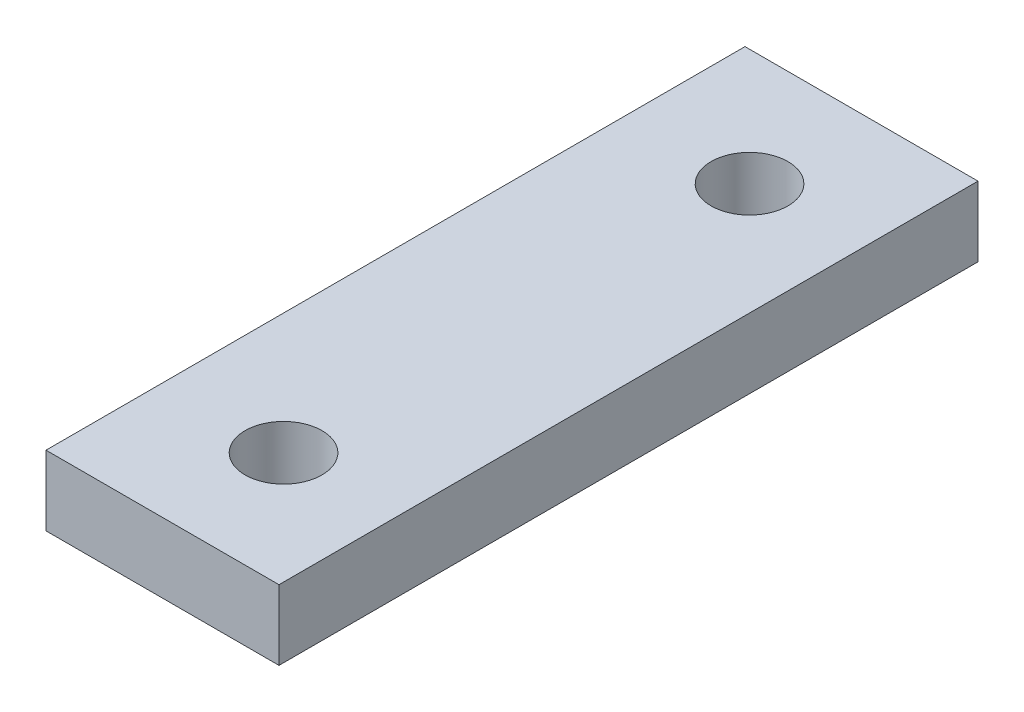
ISO-10303-21;
HEADER;
FILE_DESCRIPTION(('STEP AP214'),'2;1');
FILE_NAME('part.step','',(''),(''),'','','');
FILE_SCHEMA(('AUTOMOTIVE_DESIGN { 1 0 10303 214 1 1 1 1 }'));
ENDSEC;
DATA;
#1=APPLICATION_CONTEXT('core data for automotive mechanical design processes');
#2=APPLICATION_PROTOCOL_DEFINITION('international standard','automotive_design',2000,#1);
#3=PRODUCT_CONTEXT('',#1,'mechanical');
#4=PRODUCT('Part','Part','',(#3));
#5=PRODUCT_RELATED_PRODUCT_CATEGORY('part','',(#4));
#6=PRODUCT_DEFINITION_FORMATION('','',#4);
#7=PRODUCT_DEFINITION_CONTEXT('part definition',#1,'design');
#8=PRODUCT_DEFINITION('design','',#6,#7);
#9=PRODUCT_DEFINITION_SHAPE('','',#8);
#10=(LENGTH_UNIT() NAMED_UNIT(*) SI_UNIT(.MILLI.,.METRE.));
#11=(NAMED_UNIT(*) PLANE_ANGLE_UNIT() SI_UNIT($,.RADIAN.));
#12=(NAMED_UNIT(*) SI_UNIT($,.STERADIAN.) SOLID_ANGLE_UNIT());
#13=UNCERTAINTY_MEASURE_WITH_UNIT(LENGTH_MEASURE(1.E-05),#10,'distance_accuracy_value','');
#14=(GEOMETRIC_REPRESENTATION_CONTEXT(3) GLOBAL_UNCERTAINTY_ASSIGNED_CONTEXT((#13)) GLOBAL_UNIT_ASSIGNED_CONTEXT((#10,
#11,#12)) REPRESENTATION_CONTEXT('',''));
#15=CARTESIAN_POINT('',(0.,0.,0.));
#16=DIRECTION('',(0.,0.,1.));
#17=DIRECTION('',(1.,0.,0.));
#18=AXIS2_PLACEMENT_3D('',#15,#16,#17);
#19=CARTESIAN_POINT('',(0.,3.,0.));
#20=DIRECTION('',(0.,-1.,0.));
#21=DIRECTION('',(0.,0.,-1.));
#22=AXIS2_PLACEMENT_3D('',#19,#20,#21);
#23=PLANE('',#22);
#24=DIRECTION('',(0.,0.,1.));
#25=VECTOR('',#24,1.);
#26=CARTESIAN_POINT('',(0.,3.,0.));
#27=LINE('',#26,#25);
#28=CARTESIAN_POINT('',(0.,3.,-30.));
#29=VERTEX_POINT('',#28);
#30=CARTESIAN_POINT('',(0.,3.,0.));
#31=VERTEX_POINT('',#30);
#32=EDGE_CURVE('E92',#29,#31,#27,.T.);
#33=ORIENTED_EDGE('',*,*,#32,.T.);
#34=DIRECTION('',(1.,0.,0.));
#35=VECTOR('',#34,1.);
#36=CARTESIAN_POINT('',(0.,3.,0.));
#37=LINE('',#36,#35);
#38=CARTESIAN_POINT('',(10.,3.,0.));
#39=VERTEX_POINT('',#38);
#40=EDGE_CURVE('E87',#31,#39,#37,.T.);
#41=ORIENTED_EDGE('',*,*,#40,.T.);
#42=DIRECTION('',(0.,0.,-1.));
#43=VECTOR('',#42,1.);
#44=CARTESIAN_POINT('',(10.,3.,0.));
#45=LINE('',#44,#43);
#46=CARTESIAN_POINT('',(10.,3.,-30.));
#47=VERTEX_POINT('',#46);
#48=EDGE_CURVE('E90',#39,#47,#45,.T.);
#49=ORIENTED_EDGE('',*,*,#48,.T.);
#50=DIRECTION('',(-1.,0.,0.));
#51=VECTOR('',#50,1.);
#52=CARTESIAN_POINT('',(0.,3.,-30.));
#53=LINE('',#52,#51);
#54=EDGE_CURVE('E57',#47,#29,#53,.T.);
#55=ORIENTED_EDGE('',*,*,#54,.T.);
#56=EDGE_LOOP('',(#33,#41,#49,#55));
#57=FACE_BOUND('',#56,.T.);
#58=CARTESIAN_POINT('',(5.19446566831684,3.,-25.));
#59=DIRECTION('',(0.,1.,0.));
#60=DIRECTION('',(0.,0.,1.));
#61=AXIS2_PLACEMENT_3D('',#58,#59,#60);
#62=CIRCLE('',#61,1.65);
#63=CARTESIAN_POINT('',(5.19446566831684,3.,-23.35));
#64=VERTEX_POINT('',#63);
#65=EDGE_CURVE('E112',#64,#64,#62,.T.);
#66=ORIENTED_EDGE('',*,*,#65,.F.);
#67=EDGE_LOOP('',(#66));
#68=FACE_BOUND('',#67,.T.);
#69=CARTESIAN_POINT('',(5.19446566831684,3.,-5.));
#70=DIRECTION('',(0.,1.,0.));
#71=DIRECTION('',(0.,0.,-1.));
#72=AXIS2_PLACEMENT_3D('',#69,#70,#71);
#73=CIRCLE('',#72,1.65);
#74=CARTESIAN_POINT('',(5.19446566831684,3.,-6.65));
#75=VERTEX_POINT('',#74);
#76=EDGE_CURVE('E134',#75,#75,#73,.T.);
#77=ORIENTED_EDGE('',*,*,#76,.F.);
#78=EDGE_LOOP('',(#77));
#79=FACE_BOUND('',#78,.T.);
#80=ADVANCED_FACE('F39',(#57,#68,#79),#23,.F.);
#81=CARTESIAN_POINT('',(0.,0.,0.));
#82=DIRECTION('',(0.,-1.,0.));
#83=DIRECTION('',(0.,0.,-1.));
#84=AXIS2_PLACEMENT_3D('',#81,#82,#83);
#85=PLANE('',#84);
#86=CARTESIAN_POINT('',(5.19446566831684,0.,-25.));
#87=DIRECTION('',(0.,1.,0.));
#88=DIRECTION('',(0.,0.,1.));
#89=AXIS2_PLACEMENT_3D('',#86,#87,#88);
#90=CIRCLE('',#89,1.65);
#91=CARTESIAN_POINT('',(5.19446566831684,0.,-23.35));
#92=VERTEX_POINT('',#91);
#93=EDGE_CURVE('E130',#92,#92,#90,.T.);
#94=ORIENTED_EDGE('',*,*,#93,.T.);
#95=EDGE_LOOP('',(#94));
#96=FACE_BOUND('',#95,.T.);
#97=DIRECTION('',(0.,0.,1.));
#98=VECTOR('',#97,1.);
#99=CARTESIAN_POINT('',(0.,0.,0.));
#100=LINE('',#99,#98);
#101=CARTESIAN_POINT('',(0.,0.,-30.));
#102=VERTEX_POINT('',#101);
#103=CARTESIAN_POINT('',(0.,0.,0.));
#104=VERTEX_POINT('',#103);
#105=EDGE_CURVE('E108',#102,#104,#100,.T.);
#106=ORIENTED_EDGE('',*,*,#105,.F.);
#107=DIRECTION('',(-1.,0.,0.));
#108=VECTOR('',#107,1.);
#109=CARTESIAN_POINT('',(0.,0.,-30.));
#110=LINE('',#109,#108);
#111=CARTESIAN_POINT('',(10.,0.,-30.));
#112=VERTEX_POINT('',#111);
#113=EDGE_CURVE('E80',#112,#102,#110,.T.);
#114=ORIENTED_EDGE('',*,*,#113,.F.);
#115=DIRECTION('',(0.,0.,-1.));
#116=VECTOR('',#115,1.);
#117=CARTESIAN_POINT('',(10.,0.,0.));
#118=LINE('',#117,#116);
#119=CARTESIAN_POINT('',(10.,0.,0.));
#120=VERTEX_POINT('',#119);
#121=EDGE_CURVE('E74',#120,#112,#118,.T.);
#122=ORIENTED_EDGE('',*,*,#121,.F.);
#123=DIRECTION('',(1.,0.,0.));
#124=VECTOR('',#123,1.);
#125=CARTESIAN_POINT('',(0.,0.,0.));
#126=LINE('',#125,#124);
#127=EDGE_CURVE('E97',#104,#120,#126,.T.);
#128=ORIENTED_EDGE('',*,*,#127,.F.);
#129=EDGE_LOOP('',(#106,#114,#122,#128));
#130=FACE_BOUND('',#129,.T.);
#131=CARTESIAN_POINT('',(5.19446566831684,0.,-5.));
#132=DIRECTION('',(0.,1.,0.));
#133=DIRECTION('',(0.,0.,-1.));
#134=AXIS2_PLACEMENT_3D('',#131,#132,#133);
#135=CIRCLE('',#134,1.65);
#136=CARTESIAN_POINT('',(5.19446566831684,0.,-6.65));
#137=VERTEX_POINT('',#136);
#138=EDGE_CURVE('E138',#137,#137,#135,.T.);
#139=ORIENTED_EDGE('',*,*,#138,.T.);
#140=EDGE_LOOP('',(#139));
#141=FACE_BOUND('',#140,.T.);
#142=ADVANCED_FACE('F125',(#96,#130,#141),#85,.T.);
#143=CARTESIAN_POINT('',(0.,3.,0.));
#144=DIRECTION('',(1.,0.,0.));
#145=DIRECTION('',(0.,0.,-1.));
#146=AXIS2_PLACEMENT_3D('',#143,#144,#145);
#147=PLANE('',#146);
#148=ORIENTED_EDGE('',*,*,#105,.T.);
#149=DIRECTION('',(0.,-1.,0.));
#150=VECTOR('',#149,1.);
#151=CARTESIAN_POINT('',(0.,3.,0.));
#152=LINE('',#151,#150);
#153=EDGE_CURVE('E11',#31,#104,#152,.T.);
#154=ORIENTED_EDGE('',*,*,#153,.F.);
#155=ORIENTED_EDGE('',*,*,#32,.F.);
#156=DIRECTION('',(0.,-1.,0.));
#157=VECTOR('',#156,1.);
#158=CARTESIAN_POINT('',(0.,3.,-30.));
#159=LINE('',#158,#157);
#160=EDGE_CURVE('E104',#29,#102,#159,.T.);
#161=ORIENTED_EDGE('',*,*,#160,.T.);
#162=EDGE_LOOP('',(#148,#154,#155,#161));
#163=FACE_BOUND('',#162,.T.);
#164=ADVANCED_FACE('F41',(#163),#147,.F.);
#165=CARTESIAN_POINT('',(0.,3.,0.));
#166=DIRECTION('',(0.,0.,-1.));
#167=DIRECTION('',(-1.,0.,0.));
#168=AXIS2_PLACEMENT_3D('',#165,#166,#167);
#169=PLANE('',#168);
#170=ORIENTED_EDGE('',*,*,#127,.T.);
#171=DIRECTION('',(0.,-1.,0.));
#172=VECTOR('',#171,1.);
#173=CARTESIAN_POINT('',(10.,3.,0.));
#174=LINE('',#173,#172);
#175=EDGE_CURVE('E49',#39,#120,#174,.T.);
#176=ORIENTED_EDGE('',*,*,#175,.F.);
#177=ORIENTED_EDGE('',*,*,#40,.F.);
#178=ORIENTED_EDGE('',*,*,#153,.T.);
#179=EDGE_LOOP('',(#170,#176,#177,#178));
#180=FACE_BOUND('',#179,.T.);
#181=ADVANCED_FACE('F96',(#180),#169,.F.);
#182=CARTESIAN_POINT('',(10.,3.,0.));
#183=DIRECTION('',(-1.,0.,0.));
#184=DIRECTION('',(0.,0.,1.));
#185=AXIS2_PLACEMENT_3D('',#182,#183,#184);
#186=PLANE('',#185);
#187=ORIENTED_EDGE('',*,*,#121,.T.);
#188=DIRECTION('',(0.,-1.,0.));
#189=VECTOR('',#188,1.);
#190=CARTESIAN_POINT('',(10.,3.,-30.));
#191=LINE('',#190,#189);
#192=EDGE_CURVE('E99',#47,#112,#191,.T.);
#193=ORIENTED_EDGE('',*,*,#192,.F.);
#194=ORIENTED_EDGE('',*,*,#48,.F.);
#195=ORIENTED_EDGE('',*,*,#175,.T.);
#196=EDGE_LOOP('',(#187,#193,#194,#195));
#197=FACE_BOUND('',#196,.T.);
#198=ADVANCED_FACE('F100',(#197),#186,.F.);
#199=CARTESIAN_POINT('',(0.,3.,-30.));
#200=DIRECTION('',(0.,0.,1.));
#201=DIRECTION('',(1.,0.,0.));
#202=AXIS2_PLACEMENT_3D('',#199,#200,#201);
#203=PLANE('',#202);
#204=ORIENTED_EDGE('',*,*,#113,.T.);
#205=ORIENTED_EDGE('',*,*,#160,.F.);
#206=ORIENTED_EDGE('',*,*,#54,.F.);
#207=ORIENTED_EDGE('',*,*,#192,.T.);
#208=EDGE_LOOP('',(#204,#205,#206,#207));
#209=FACE_BOUND('',#208,.T.);
#210=ADVANCED_FACE('F122',(#209),#203,.F.);
#211=CARTESIAN_POINT('',(5.19446566831684,3.,-25.));
#212=DIRECTION('',(0.,-1.,0.));
#213=DIRECTION('',(0.,0.,-1.));
#214=AXIS2_PLACEMENT_3D('',#211,#212,#213);
#215=CYLINDRICAL_SURFACE('',#214,1.65);
#216=ORIENTED_EDGE('',*,*,#65,.T.);
#217=EDGE_LOOP('',(#216));
#218=FACE_BOUND('',#217,.T.);
#219=ORIENTED_EDGE('',*,*,#93,.F.);
#220=EDGE_LOOP('',(#219));
#221=FACE_BOUND('',#220,.T.);
#222=ADVANCED_FACE('F157',(#218,#221),#215,.F.);
#223=CARTESIAN_POINT('',(5.19446566831684,3.,-5.));
#224=DIRECTION('',(0.,-1.,0.));
#225=DIRECTION('',(0.,0.,-1.));
#226=AXIS2_PLACEMENT_3D('',#223,#224,#225);
#227=CYLINDRICAL_SURFACE('',#226,1.65);
#228=ORIENTED_EDGE('',*,*,#76,.T.);
#229=EDGE_LOOP('',(#228));
#230=FACE_BOUND('',#229,.T.);
#231=ORIENTED_EDGE('',*,*,#138,.F.);
#232=EDGE_LOOP('',(#231));
#233=FACE_BOUND('',#232,.T.);
#234=ADVANCED_FACE('F146',(#230,#233),#227,.F.);
#235=CLOSED_SHELL('',(#80,#142,#164,#181,#198,#210,#222,#234));
#236=MANIFOLD_SOLID_BREP('B2',#235);
#237=ADVANCED_BREP_SHAPE_REPRESENTATION('',(#18,#236),#14);
#238=SHAPE_DEFINITION_REPRESENTATION(#9,#237);
ENDSEC;
END-ISO-10303-21;
